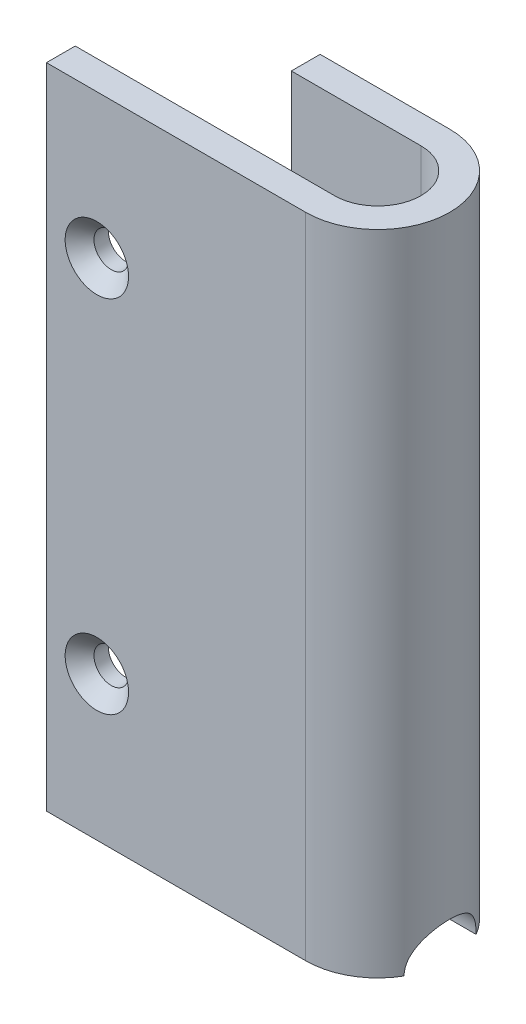
ISO-10303-21;
HEADER;
FILE_DESCRIPTION(('STEP AP214'),'2;1');
FILE_NAME('part.step','',(''),(''),'','','');
FILE_SCHEMA(('AUTOMOTIVE_DESIGN { 1 0 10303 214 1 1 1 1 }'));
ENDSEC;
DATA;
#1=APPLICATION_CONTEXT('core data for automotive mechanical design processes');
#2=APPLICATION_PROTOCOL_DEFINITION('international standard','automotive_design',2000,#1);
#3=PRODUCT_CONTEXT('',#1,'mechanical');
#4=PRODUCT('Part','Part','',(#3));
#5=PRODUCT_RELATED_PRODUCT_CATEGORY('part','',(#4));
#6=PRODUCT_DEFINITION_FORMATION('','',#4);
#7=PRODUCT_DEFINITION_CONTEXT('part definition',#1,'design');
#8=PRODUCT_DEFINITION('design','',#6,#7);
#9=PRODUCT_DEFINITION_SHAPE('','',#8);
#10=(LENGTH_UNIT() NAMED_UNIT(*) SI_UNIT(.MILLI.,.METRE.));
#11=(NAMED_UNIT(*) PLANE_ANGLE_UNIT() SI_UNIT($,.RADIAN.));
#12=(NAMED_UNIT(*) SI_UNIT($,.STERADIAN.) SOLID_ANGLE_UNIT());
#13=UNCERTAINTY_MEASURE_WITH_UNIT(LENGTH_MEASURE(1.E-05),#10,'distance_accuracy_value','');
#14=(GEOMETRIC_REPRESENTATION_CONTEXT(3) GLOBAL_UNCERTAINTY_ASSIGNED_CONTEXT((#13)) GLOBAL_UNIT_ASSIGNED_CONTEXT((#10,
#11,#12)) REPRESENTATION_CONTEXT('',''));
#15=CARTESIAN_POINT('',(0.,0.,0.));
#16=DIRECTION('',(0.,0.,1.));
#17=DIRECTION('',(1.,0.,0.));
#18=AXIS2_PLACEMENT_3D('',#15,#16,#17);
#19=CARTESIAN_POINT('',(0.,45.,0.));
#20=DIRECTION('',(0.,-1.,0.));
#21=DIRECTION('',(0.,0.,-1.));
#22=AXIS2_PLACEMENT_3D('',#19,#20,#21);
#23=CYLINDRICAL_SURFACE('',#22,5.);
#24=CARTESIAN_POINT('',(4.33012701892219,0.,-2.5));
#25=CARTESIAN_POINT('',(4.33010776213733,0.0654724350316677,-2.50001179836251));
#26=CARTESIAN_POINT('',(4.33161146224051,0.130934169776571,-2.49742842336447));
#27=CARTESIAN_POINT('',(4.33751978184666,0.261285899844576,-2.48716418163323));
#28=CARTESIAN_POINT('',(4.34192261900449,0.326176221640754,-2.47948644681233));
#29=CARTESIAN_POINT('',(4.35345141400719,0.454547532744297,-2.45918447990414));
#30=CARTESIAN_POINT('',(4.36056161975426,0.518034467963284,-2.44658885069503));
#31=CARTESIAN_POINT('',(4.37724282284499,0.643527614087744,-2.41661724515945));
#32=CARTESIAN_POINT('',(4.38681410283551,0.705533654022406,-2.3992407197456));
#33=CARTESIAN_POINT('',(4.41871214349951,0.888464031589053,-2.34029688750615));
#34=CARTESIAN_POINT('',(4.44426107983369,1.00668892728128,-2.29185258147667));
#35=CARTESIAN_POINT('',(4.50102114369154,1.23341693587535,-2.17826216975077));
#36=CARTESIAN_POINT('',(4.53224102252611,1.34190463038616,-2.11309018504652));
#37=CARTESIAN_POINT('',(4.59992530155802,1.55577114238783,-1.96165876169868));
#38=CARTESIAN_POINT('',(4.63660980230517,1.66016997889454,-1.87411057186877));
#39=CARTESIAN_POINT('',(4.70930785657946,1.85354271470454,-1.68311069098592));
#40=CARTESIAN_POINT('',(4.74532122571924,1.94251242917414,-1.57965469957761));
#41=CARTESIAN_POINT('',(4.81553674339751,2.10841707238449,-1.35122448738113));
#42=CARTESIAN_POINT('',(4.84945238909967,2.18413370998771,-1.22526897701463));
#43=CARTESIAN_POINT('',(4.90876871743035,2.31285185160815,-0.960393600863944));
#44=CARTESIAN_POINT('',(4.93417470668173,2.3658675177187,-0.821481883935598));
#45=CARTESIAN_POINT('',(4.9720113803684,2.44376131740857,-0.545113455243545));
#46=CARTESIAN_POINT('',(4.98523678997644,2.47037337425095,-0.408256720567087));
#47=CARTESIAN_POINT('',(5.00018956643823,2.50041524569561,-0.131428863746883));
#48=CARTESIAN_POINT('',(5.00192370311413,2.50385870956598,0.00854037595561001));
#49=CARTESIAN_POINT('',(4.99407451216908,2.48813324304431,0.274582525450838));
#50=CARTESIAN_POINT('',(4.98546223180199,2.47090463519448,0.40080541240597));
#51=CARTESIAN_POINT('',(4.95935579725978,2.41779719968455,0.648286752405086));
#52=CARTESIAN_POINT('',(4.94186114786187,2.38191733214957,0.769544928241872));
#53=CARTESIAN_POINT('',(4.89928974288563,2.29229393966775,1.00577259267237));
#54=CARTESIAN_POINT('',(4.87411141896958,2.23831009471259,1.12063184244932));
#55=CARTESIAN_POINT('',(4.81844159486509,2.11434242062065,1.3399404674424));
#56=CARTESIAN_POINT('',(4.78794811508603,2.04435262714526,1.44438594125974));
#57=CARTESIAN_POINT('',(4.72111214797706,1.8827673990732,1.65042713157186));
#58=CARTESIAN_POINT('',(4.68448924833205,1.78975568976913,1.75082198597595));
#59=CARTESIAN_POINT('',(4.61136315843599,1.58853854847496,1.9352501871044));
#60=CARTESIAN_POINT('',(4.5748601047173,1.48031958801658,2.01926880480682));
#61=CARTESIAN_POINT('',(4.503579139904,1.24330068232173,2.1738171411083));
#62=CARTESIAN_POINT('',(4.46906219482226,1.11362572851798,2.24313548885981));
#63=CARTESIAN_POINT('',(4.40934996096533,0.842442531530035,2.35836398289386));
#64=CARTESIAN_POINT('',(4.38413238163266,0.700963594907247,2.40433020546799));
#65=CARTESIAN_POINT('',(4.35412015572563,0.465222711798028,2.45809029210406));
#66=CARTESIAN_POINT('',(4.34521143406772,0.373217559621034,2.47373896858613));
#67=CARTESIAN_POINT('',(4.33317629399904,0.187508830095871,2.49472015739655));
#68=CARTESIAN_POINT('',(4.33006008341912,0.0938025477150808,2.50003445877024));
#69=CARTESIAN_POINT('',(4.33012701892219,0.,2.5));
#70=B_SPLINE_CURVE_WITH_KNOTS('',3,(#24,#25,#26,#27,#28,#29,#30,#31,#32,#33,#34,#35,#36,#37,#38,
#39,#40,#41,#42,#43,#44,#45,#46,#47,#48,#49,#50,#51,#52,#53,#54,#55,#56,#57,#58,#59,#60,#61,#62,
#63,#64,#65,#66,#67,#68,#69),.UNSPECIFIED.,.F.,.F.,(4,2,2,2,2,2,2,2,2,2,2,2,2,2,2,2,2,2,2,2,2,2,
4),(0.,0.196331555537111,0.392542521988314,0.587628912502733,0.782737718108245,1.17178476798555,
1.56143737011987,1.98295902719593,2.40459483519142,2.85470113901088,3.30452623161875,
3.72233927392692,4.13990614928148,4.52116163006039,4.90243836948527,5.28899106640394,
5.67568804085465,6.09890794628564,6.52250676283661,6.97328472614771,7.42297504209209,
7.703516039156,7.98455095154996),.UNSPECIFIED.);
#71=CARTESIAN_POINT('',(4.33012701892219,0.,-2.5));
#72=VERTEX_POINT('',#71);
#73=CARTESIAN_POINT('',(4.33012701892219,0.,2.5));
#74=VERTEX_POINT('',#73);
#75=EDGE_CURVE('E53',#72,#74,#70,.T.);
#76=ORIENTED_EDGE('',*,*,#75,.F.);
#77=CARTESIAN_POINT('',(0.,0.,0.));
#78=DIRECTION('',(0.,1.,0.));
#79=DIRECTION('',(0.,0.,1.));
#80=AXIS2_PLACEMENT_3D('',#77,#78,#79);
#81=CIRCLE('',#80,5.);
#82=CARTESIAN_POINT('',(0.,0.,-5.));
#83=VERTEX_POINT('',#82);
#84=EDGE_CURVE('E255',#72,#83,#81,.T.);
#85=ORIENTED_EDGE('',*,*,#84,.T.);
#86=DIRECTION('',(0.,-1.,0.));
#87=VECTOR('',#86,1.);
#88=CARTESIAN_POINT('',(0.,45.,-5.));
#89=LINE('',#88,#87);
#90=CARTESIAN_POINT('',(0.,45.,-5.));
#91=VERTEX_POINT('',#90);
#92=EDGE_CURVE('E183',#91,#83,#89,.T.);
#93=ORIENTED_EDGE('',*,*,#92,.F.);
#94=CARTESIAN_POINT('',(0.,45.,0.));
#95=DIRECTION('',(0.,1.,0.));
#96=DIRECTION('',(0.,0.,1.));
#97=AXIS2_PLACEMENT_3D('',#94,#95,#96);
#98=CIRCLE('',#97,5.);
#99=CARTESIAN_POINT('',(0.,45.,5.));
#100=VERTEX_POINT('',#99);
#101=EDGE_CURVE('E160',#100,#91,#98,.T.);
#102=ORIENTED_EDGE('',*,*,#101,.F.);
#103=DIRECTION('',(0.,-1.,0.));
#104=VECTOR('',#103,1.);
#105=CARTESIAN_POINT('',(0.,45.,5.));
#106=LINE('',#105,#104);
#107=CARTESIAN_POINT('',(0.,0.,5.));
#108=VERTEX_POINT('',#107);
#109=EDGE_CURVE('E161',#100,#108,#106,.T.);
#110=ORIENTED_EDGE('',*,*,#109,.T.);
#111=EDGE_CURVE('E257',#108,#74,#81,.T.);
#112=ORIENTED_EDGE('',*,*,#111,.T.);
#113=EDGE_LOOP('',(#76,#85,#93,#102,#110,#112));
#114=FACE_BOUND('',#113,.T.);
#115=ADVANCED_FACE('F37',(#114),#23,.T.);
#116=CARTESIAN_POINT('',(0.,45.,0.));
#117=DIRECTION('',(0.,-1.,0.));
#118=DIRECTION('',(0.,0.,-1.));
#119=AXIS2_PLACEMENT_3D('',#116,#117,#118);
#120=CYLINDRICAL_SURFACE('',#119,3.);
#121=CARTESIAN_POINT('',(1.6583123951777,0.,2.5));
#122=CARTESIAN_POINT('',(1.65828023930748,0.0446676190961317,2.50001053689097));
#123=CARTESIAN_POINT('',(1.6601162772629,0.0893146756582369,2.4988033626358));
#124=CARTESIAN_POINT('',(1.66727317263237,0.178118808575002,2.49403945424106));
#125=CARTESIAN_POINT('',(1.6725873117957,0.222276662985004,2.49048724961452));
#126=CARTESIAN_POINT('',(1.68634898291668,0.309186552805204,2.48118723003889));
#127=CARTESIAN_POINT('',(1.69474943169534,0.351949707497493,2.47547237004125));
#128=CARTESIAN_POINT('',(1.71430901873713,0.436516845554968,2.46196831278083));
#129=CARTESIAN_POINT('',(1.72546968412583,0.478320283905717,2.4541779670438));
#130=CARTESIAN_POINT('',(1.77222694334977,0.634726425048257,2.42094569151118));
#131=CARTESIAN_POINT('',(1.81578246635465,0.745590990119863,2.38888265367655));
#132=CARTESIAN_POINT('',(1.91309058631366,0.958667215286081,2.31170305357438));
#133=CARTESIAN_POINT('',(1.96692669689501,1.06079733200861,2.26647787223487));
#134=CARTESIAN_POINT('',(2.06333806009318,1.22908717969098,2.17845139252835));
#135=CARTESIAN_POINT('',(2.1048774408808,1.29734727342663,2.13847839662807));
#136=CARTESIAN_POINT('',(2.18877312173698,1.42945216003766,2.05253160808423));
#137=CARTESIAN_POINT('',(2.23112976012055,1.49329507193551,2.00655528279989));
#138=CARTESIAN_POINT('',(2.35737927069942,1.6779004660602,1.85992335660286));
#139=CARTESIAN_POINT('',(2.44073385868862,1.79220223726549,1.75032166679399));
#140=CARTESIAN_POINT('',(2.58107663651362,1.97858484857952,1.53332316028441));
#141=CARTESIAN_POINT('',(2.63991085386503,2.05448117836859,1.43037180448629));
#142=CARTESIAN_POINT('',(2.74774689794263,2.1913233385864,1.2102993528412));
#143=CARTESIAN_POINT('',(2.79676246687923,2.25229009148166,1.09319843428568));
#144=CARTESIAN_POINT('',(2.87372981565163,2.34711358323241,0.867928883305844));
#145=CARTESIAN_POINT('',(2.90385830152504,2.38383517864743,0.761717046456572));
#146=CARTESIAN_POINT('',(2.95260444248339,2.44298114981979,0.542830448073814));
#147=CARTESIAN_POINT('',(2.97122910862281,2.46541423403497,0.430159668824158));
#148=CARTESIAN_POINT('',(2.99549159829453,2.49460149180071,0.200906226670661));
#149=CARTESIAN_POINT('',(3.00107488681869,2.50128982658614,0.084309197767444));
#150=CARTESIAN_POINT('',(2.99858143920542,2.49829775944192,-0.148527340090261));
#151=CARTESIAN_POINT('',(2.99050499932993,2.48861771252143,-0.264766856743951));
#152=CARTESIAN_POINT('',(2.9624133944372,2.45478579221321,-0.485445759029536));
#153=CARTESIAN_POINT('',(2.94323604357122,2.4316490006219,-0.590153469719608));
#154=CARTESIAN_POINT('',(2.89501327215416,2.37305235039453,-0.793625750717645));
#155=CARTESIAN_POINT('',(2.86596638567854,2.33759066112049,-0.89238943559136));
#156=CARTESIAN_POINT('',(2.79690287446882,2.25240860554023,-1.09053416369654));
#157=CARTESIAN_POINT('',(2.7561602110168,2.20172771983301,-1.18924473934223));
#158=CARTESIAN_POINT('',(2.66744714285833,2.08960269254212,-1.37678007181262));
#159=CARTESIAN_POINT('',(2.61947031903861,2.02814898391746,-1.46559592577918));
#160=CARTESIAN_POINT('',(2.49448801107938,1.86454080960493,-1.67280362441447));
#161=CARTESIAN_POINT('',(2.41452810108691,1.75692904106795,-1.78517382835749));
#162=CARTESIAN_POINT('',(2.29203972156857,1.58276013263233,-1.93670155603641));
#163=CARTESIAN_POINT('',(2.25072647403066,1.52248619627438,-1.98442714978064));
#164=CARTESIAN_POINT('',(2.16828385513605,1.3977282287984,-2.07418686478912));
#165=CARTESIAN_POINT('',(2.12715442261522,1.33324573004269,-2.11622304065683));
#166=CARTESIAN_POINT('',(2.02736668216146,1.16889290959049,-2.2128219038431));
#167=CARTESIAN_POINT('',(1.96949413582952,1.06656162182181,-2.26406445132993));
#168=CARTESIAN_POINT('',(1.86215058777701,0.852162280933745,-2.35313154217165));
#169=CARTESIAN_POINT('',(1.81265778441366,0.740120677710054,-2.39099119237605));
#170=CARTESIAN_POINT('',(1.74312521040049,0.542368123492112,-2.44187928159533));
#171=CARTESIAN_POINT('',(1.71871174214238,0.459278569532435,-2.45896760338397));
#172=CARTESIAN_POINT('',(1.68136078058062,0.289382777852337,-2.48466533863309));
#173=CARTESIAN_POINT('',(1.66838023493806,0.202591784872539,-2.49330657445815));
#174=CARTESIAN_POINT('',(1.66098011654761,0.0960725270432394,-2.49822814088172));
#175=CARTESIAN_POINT('',(1.65998140373825,0.0768814878014884,-2.49889195042314));
#176=CARTESIAN_POINT('',(1.65864846758548,0.0384623376736757,-2.49977745262101));
#177=CARTESIAN_POINT('',(1.65831437598636,0.0192342201937559,-2.49999905762164));
#178=CARTESIAN_POINT('',(1.6583123951777,0.,-2.5));
#179=B_SPLINE_CURVE_WITH_KNOTS('',3,(#121,#122,#123,#124,#125,#126,#127,#128,#129,#130,#131,
#132,#133,#134,#135,#136,#137,#138,#139,#140,#141,#142,#143,#144,#145,#146,#147,#148,#149,#150,
#151,#152,#153,#154,#155,#156,#157,#158,#159,#160,#161,#162,#163,#164,#165,#166,#167,#168,#169,
#170,#171,#172,#173,#174,#175,#176,#177,#178),.UNSPECIFIED.,.F.,.F.,(4,2,2,2,2,2,2,2,2,2,2,2,2,
2,2,2,2,2,2,2,2,2,2,2,2,2,2,2,4),(0.,0.133915809511519,0.267573709534379,0.399271959248707,
0.531043236367043,0.898867426511492,1.26981755381918,1.53753000139772,1.80535575667043,
2.33924592067391,2.76010881123974,3.18037848070635,3.52797653415752,3.87536253284726,
4.22419861170399,4.57302712485182,4.89843954153486,5.22390031294722,5.57721326116426,
5.93084158108768,6.45264424433969,6.71427180911988,6.97580463953598,7.35949670871463,
7.74217465007992,8.00607441227289,8.26897611958204,8.32665105551861,8.38433742291031),.UNSPECIFIED.);
#180=CARTESIAN_POINT('',(1.6583123951777,0.,2.5));
#181=VERTEX_POINT('',#180);
#182=CARTESIAN_POINT('',(1.6583123951777,0.,-2.5));
#183=VERTEX_POINT('',#182);
#184=EDGE_CURVE('E126',#181,#183,#179,.T.);
#185=ORIENTED_EDGE('',*,*,#184,.F.);
#186=CARTESIAN_POINT('',(0.,0.,0.));
#187=DIRECTION('',(0.,-1.,0.));
#188=DIRECTION('',(0.,0.,1.));
#189=AXIS2_PLACEMENT_3D('',#186,#187,#188);
#190=CIRCLE('',#189,3.);
#191=CARTESIAN_POINT('',(0.,0.,3.));
#192=VERTEX_POINT('',#191);
#193=EDGE_CURVE('E138',#181,#192,#190,.T.);
#194=ORIENTED_EDGE('',*,*,#193,.T.);
#195=DIRECTION('',(0.,-1.,0.));
#196=VECTOR('',#195,1.);
#197=CARTESIAN_POINT('',(0.,45.,3.));
#198=LINE('',#197,#196);
#199=CARTESIAN_POINT('',(0.,45.,3.));
#200=VERTEX_POINT('',#199);
#201=EDGE_CURVE('E171',#200,#192,#198,.T.);
#202=ORIENTED_EDGE('',*,*,#201,.F.);
#203=CARTESIAN_POINT('',(0.,45.,0.));
#204=DIRECTION('',(0.,-1.,0.));
#205=DIRECTION('',(0.,0.,1.));
#206=AXIS2_PLACEMENT_3D('',#203,#204,#205);
#207=CIRCLE('',#206,3.);
#208=CARTESIAN_POINT('',(0.,45.,-3.));
#209=VERTEX_POINT('',#208);
#210=EDGE_CURVE('E277',#209,#200,#207,.T.);
#211=ORIENTED_EDGE('',*,*,#210,.F.);
#212=DIRECTION('',(0.,-1.,0.));
#213=VECTOR('',#212,1.);
#214=CARTESIAN_POINT('',(0.,45.,-3.));
#215=LINE('',#214,#213);
#216=CARTESIAN_POINT('',(0.,0.,-3.));
#217=VERTEX_POINT('',#216);
#218=EDGE_CURVE('E173',#209,#217,#215,.T.);
#219=ORIENTED_EDGE('',*,*,#218,.T.);
#220=EDGE_CURVE('E142',#217,#183,#190,.T.);
#221=ORIENTED_EDGE('',*,*,#220,.T.);
#222=EDGE_LOOP('',(#185,#194,#202,#211,#219,#221));
#223=FACE_BOUND('',#222,.T.);
#224=ADVANCED_FACE('F136',(#223),#120,.F.);
#225=CARTESIAN_POINT('',(0.,0.,0.));
#226=DIRECTION('',(0.,1.,0.));
#227=DIRECTION('',(0.,0.,1.));
#228=AXIS2_PLACEMENT_3D('',#225,#226,#227);
#229=PLANE('',#228);
#230=DIRECTION('',(-1.,0.,0.));
#231=VECTOR('',#230,1.);
#232=CARTESIAN_POINT('',(6.,0.,-2.5));
#233=LINE('',#232,#231);
#234=EDGE_CURVE('E11',#183,#72,#233,.F.);
#235=ORIENTED_EDGE('',*,*,#234,.F.);
#236=ORIENTED_EDGE('',*,*,#220,.F.);
#237=DIRECTION('',(1.,0.,0.));
#238=VECTOR('',#237,1.);
#239=CARTESIAN_POINT('',(0.,0.,-3.));
#240=LINE('',#239,#238);
#241=CARTESIAN_POINT('',(-9.,0.,-3.));
#242=VERTEX_POINT('',#241);
#243=EDGE_CURVE('E149',#242,#217,#240,.T.);
#244=ORIENTED_EDGE('',*,*,#243,.F.);
#245=DIRECTION('',(0.,0.,1.));
#246=VECTOR('',#245,1.);
#247=CARTESIAN_POINT('',(-9.,0.,-5.));
#248=LINE('',#247,#246);
#249=CARTESIAN_POINT('',(-9.,0.,-5.));
#250=VERTEX_POINT('',#249);
#251=EDGE_CURVE('E151',#250,#242,#248,.T.);
#252=ORIENTED_EDGE('',*,*,#251,.F.);
#253=DIRECTION('',(-1.,0.,0.));
#254=VECTOR('',#253,1.);
#255=CARTESIAN_POINT('',(0.,0.,-5.));
#256=LINE('',#255,#254);
#257=EDGE_CURVE('E261',#83,#250,#256,.T.);
#258=ORIENTED_EDGE('',*,*,#257,.F.);
#259=ORIENTED_EDGE('',*,*,#84,.F.);
#260=EDGE_LOOP('',(#235,#236,#244,#252,#258,#259));
#261=FACE_BOUND('',#260,.T.);
#262=ADVANCED_FACE('F228',(#261),#229,.F.);
#263=DIRECTION('',(-1.,0.,0.));
#264=VECTOR('',#263,1.);
#265=CARTESIAN_POINT('',(6.,0.,2.5));
#266=LINE('',#265,#264);
#267=EDGE_CURVE('E46',#74,#181,#266,.T.);
#268=ORIENTED_EDGE('',*,*,#267,.F.);
#269=ORIENTED_EDGE('',*,*,#111,.F.);
#270=DIRECTION('',(1.,0.,0.));
#271=VECTOR('',#270,1.);
#272=CARTESIAN_POINT('',(0.,0.,5.));
#273=LINE('',#272,#271);
#274=CARTESIAN_POINT('',(-18.,0.,5.));
#275=VERTEX_POINT('',#274);
#276=EDGE_CURVE('E158',#275,#108,#273,.T.);
#277=ORIENTED_EDGE('',*,*,#276,.F.);
#278=DIRECTION('',(0.,0.,1.));
#279=VECTOR('',#278,1.);
#280=CARTESIAN_POINT('',(-18.,0.,3.));
#281=LINE('',#280,#279);
#282=CARTESIAN_POINT('',(-18.,0.,3.));
#283=VERTEX_POINT('',#282);
#284=EDGE_CURVE('E156',#283,#275,#281,.T.);
#285=ORIENTED_EDGE('',*,*,#284,.F.);
#286=DIRECTION('',(-1.,0.,0.));
#287=VECTOR('',#286,1.);
#288=CARTESIAN_POINT('',(0.,0.,3.));
#289=LINE('',#288,#287);
#290=EDGE_CURVE('E148',#192,#283,#289,.T.);
#291=ORIENTED_EDGE('',*,*,#290,.F.);
#292=ORIENTED_EDGE('',*,*,#193,.F.);
#293=EDGE_LOOP('',(#268,#269,#277,#285,#291,#292));
#294=FACE_BOUND('',#293,.T.);
#295=ADVANCED_FACE('F146',(#294),#229,.F.);
#296=CARTESIAN_POINT('',(-9.,45.,-5.));
#297=DIRECTION('',(1.,0.,0.));
#298=DIRECTION('',(0.,0.,-1.));
#299=AXIS2_PLACEMENT_3D('',#296,#297,#298);
#300=PLANE('',#299);
#301=DIRECTION('',(0.,-1.,0.));
#302=VECTOR('',#301,1.);
#303=CARTESIAN_POINT('',(-9.,45.,-3.));
#304=LINE('',#303,#302);
#305=CARTESIAN_POINT('',(-9.,16.5,-3.));
#306=VERTEX_POINT('',#305);
#307=EDGE_CURVE('E175',#306,#242,#304,.T.);
#308=ORIENTED_EDGE('',*,*,#307,.F.);
#309=DIRECTION('',(0.,0.,-1.));
#310=VECTOR('',#309,1.);
#311=CARTESIAN_POINT('',(-9.,16.5,0.));
#312=LINE('',#311,#310);
#313=CARTESIAN_POINT('',(-9.,16.5,-5.));
#314=VERTEX_POINT('',#313);
#315=EDGE_CURVE('E61',#306,#314,#312,.T.);
#316=ORIENTED_EDGE('',*,*,#315,.T.);
#317=DIRECTION('',(0.,-1.,0.));
#318=VECTOR('',#317,1.);
#319=CARTESIAN_POINT('',(-9.,45.,-5.));
#320=LINE('',#319,#318);
#321=EDGE_CURVE('E179',#314,#250,#320,.T.);
#322=ORIENTED_EDGE('',*,*,#321,.T.);
#323=ORIENTED_EDGE('',*,*,#251,.T.);
#324=EDGE_LOOP('',(#308,#316,#322,#323));
#325=FACE_BOUND('',#324,.T.);
#326=ADVANCED_FACE('F272',(#325),#300,.F.);
#327=CARTESIAN_POINT('',(0.,45.,-5.));
#328=DIRECTION('',(0.,0.,1.));
#329=DIRECTION('',(1.,0.,0.));
#330=AXIS2_PLACEMENT_3D('',#327,#328,#329);
#331=PLANE('',#330);
#332=ORIENTED_EDGE('',*,*,#321,.F.);
#333=CARTESIAN_POINT('',(-9.,17.5,-5.));
#334=DIRECTION('',(0.,0.,-1.));
#335=DIRECTION('',(-1.,0.,0.));
#336=AXIS2_PLACEMENT_3D('',#333,#334,#335);
#337=CIRCLE('',#336,1.);
#338=CARTESIAN_POINT('',(-9.,18.5,-5.));
#339=VERTEX_POINT('',#338);
#340=EDGE_CURVE('E258',#339,#314,#337,.T.);
#341=ORIENTED_EDGE('',*,*,#340,.F.);
#342=CARTESIAN_POINT('',(-9.,45.,-5.));
#343=VERTEX_POINT('',#342);
#344=EDGE_CURVE('E180',#343,#339,#320,.T.);
#345=ORIENTED_EDGE('',*,*,#344,.F.);
#346=DIRECTION('',(-1.,0.,0.));
#347=VECTOR('',#346,1.);
#348=CARTESIAN_POINT('',(0.,45.,-5.));
#349=LINE('',#348,#347);
#350=EDGE_CURVE('E295',#91,#343,#349,.T.);
#351=ORIENTED_EDGE('',*,*,#350,.F.);
#352=ORIENTED_EDGE('',*,*,#92,.T.);
#353=ORIENTED_EDGE('',*,*,#257,.T.);
#354=EDGE_LOOP('',(#332,#341,#345,#351,#352,#353));
#355=FACE_BOUND('',#354,.T.);
#356=ADVANCED_FACE('F306',(#355),#331,.F.);
#357=ORIENTED_EDGE('',*,*,#344,.T.);
#358=DIRECTION('',(0.,0.,-1.));
#359=VECTOR('',#358,1.);
#360=CARTESIAN_POINT('',(-9.,18.5,0.));
#361=LINE('',#360,#359);
#362=CARTESIAN_POINT('',(-9.,18.5,-3.));
#363=VERTEX_POINT('',#362);
#364=EDGE_CURVE('E263',#339,#363,#361,.F.);
#365=ORIENTED_EDGE('',*,*,#364,.T.);
#366=CARTESIAN_POINT('',(-9.,45.,-3.));
#367=VERTEX_POINT('',#366);
#368=EDGE_CURVE('E176',#367,#363,#304,.T.);
#369=ORIENTED_EDGE('',*,*,#368,.F.);
#370=DIRECTION('',(0.,0.,1.));
#371=VECTOR('',#370,1.);
#372=CARTESIAN_POINT('',(-9.,45.,-5.));
#373=LINE('',#372,#371);
#374=EDGE_CURVE('E284',#343,#367,#373,.T.);
#375=ORIENTED_EDGE('',*,*,#374,.F.);
#376=EDGE_LOOP('',(#357,#365,#369,#375));
#377=FACE_BOUND('',#376,.T.);
#378=ADVANCED_FACE('F245',(#377),#300,.F.);
#379=CARTESIAN_POINT('',(0.,45.,-3.));
#380=DIRECTION('',(0.,0.,-1.));
#381=DIRECTION('',(-1.,0.,0.));
#382=AXIS2_PLACEMENT_3D('',#379,#380,#381);
#383=PLANE('',#382);
#384=ORIENTED_EDGE('',*,*,#368,.T.);
#385=CARTESIAN_POINT('',(-9.,17.5,-3.));
#386=DIRECTION('',(0.,0.,-1.));
#387=DIRECTION('',(-1.,0.,0.));
#388=AXIS2_PLACEMENT_3D('',#385,#386,#387);
#389=CIRCLE('',#388,1.);
#390=EDGE_CURVE('E132',#363,#306,#389,.T.);
#391=ORIENTED_EDGE('',*,*,#390,.T.);
#392=ORIENTED_EDGE('',*,*,#307,.T.);
#393=ORIENTED_EDGE('',*,*,#243,.T.);
#394=ORIENTED_EDGE('',*,*,#218,.F.);
#395=DIRECTION('',(1.,0.,0.));
#396=VECTOR('',#395,1.);
#397=CARTESIAN_POINT('',(0.,45.,-3.));
#398=LINE('',#397,#396);
#399=EDGE_CURVE('E280',#367,#209,#398,.T.);
#400=ORIENTED_EDGE('',*,*,#399,.F.);
#401=EDGE_LOOP('',(#384,#391,#392,#393,#394,#400));
#402=FACE_BOUND('',#401,.T.);
#403=ADVANCED_FACE('F240',(#402),#383,.F.);
#404=CARTESIAN_POINT('',(0.,45.,3.));
#405=DIRECTION('',(0.,0.,1.));
#406=DIRECTION('',(1.,0.,0.));
#407=AXIS2_PLACEMENT_3D('',#404,#405,#406);
#408=PLANE('',#407);
#409=CARTESIAN_POINT('',(-14.5,35.,3.));
#410=DIRECTION('',(0.,0.,1.));
#411=DIRECTION('',(1.,0.,0.));
#412=AXIS2_PLACEMENT_3D('',#409,#410,#411);
#413=CIRCLE('',#412,1.2);
#414=CARTESIAN_POINT('',(-13.3,35.,3.));
#415=VERTEX_POINT('',#414);
#416=EDGE_CURVE('E41',#415,#415,#413,.T.);
#417=ORIENTED_EDGE('',*,*,#416,.T.);
#418=EDGE_LOOP('',(#417));
#419=FACE_BOUND('',#418,.T.);
#420=CARTESIAN_POINT('',(-14.5,9.99999999999999,3.));
#421=DIRECTION('',(0.,0.,1.));
#422=DIRECTION('',(1.,0.,0.));
#423=AXIS2_PLACEMENT_3D('',#420,#421,#422);
#424=CIRCLE('',#423,1.2);
#425=CARTESIAN_POINT('',(-13.3,9.99999999999999,3.));
#426=VERTEX_POINT('',#425);
#427=EDGE_CURVE('E143',#426,#426,#424,.T.);
#428=ORIENTED_EDGE('',*,*,#427,.T.);
#429=EDGE_LOOP('',(#428));
#430=FACE_BOUND('',#429,.T.);
#431=ORIENTED_EDGE('',*,*,#290,.T.);
#432=DIRECTION('',(0.,-1.,0.));
#433=VECTOR('',#432,1.);
#434=CARTESIAN_POINT('',(-18.,45.,3.));
#435=LINE('',#434,#433);
#436=CARTESIAN_POINT('',(-18.,45.,3.));
#437=VERTEX_POINT('',#436);
#438=EDGE_CURVE('E168',#437,#283,#435,.T.);
#439=ORIENTED_EDGE('',*,*,#438,.F.);
#440=DIRECTION('',(-1.,0.,0.));
#441=VECTOR('',#440,1.);
#442=CARTESIAN_POINT('',(0.,45.,3.));
#443=LINE('',#442,#441);
#444=EDGE_CURVE('E279',#200,#437,#443,.T.);
#445=ORIENTED_EDGE('',*,*,#444,.F.);
#446=ORIENTED_EDGE('',*,*,#201,.T.);
#447=EDGE_LOOP('',(#431,#439,#445,#446));
#448=FACE_BOUND('',#447,.T.);
#449=ADVANCED_FACE('F237',(#419,#430,#448),#408,.F.);
#450=CARTESIAN_POINT('',(-18.,45.,3.));
#451=DIRECTION('',(1.,0.,0.));
#452=DIRECTION('',(0.,0.,-1.));
#453=AXIS2_PLACEMENT_3D('',#450,#451,#452);
#454=PLANE('',#453);
#455=ORIENTED_EDGE('',*,*,#284,.T.);
#456=DIRECTION('',(0.,-1.,0.));
#457=VECTOR('',#456,1.);
#458=CARTESIAN_POINT('',(-18.,45.,5.));
#459=LINE('',#458,#457);
#460=CARTESIAN_POINT('',(-18.,45.,5.));
#461=VERTEX_POINT('',#460);
#462=EDGE_CURVE('E164',#461,#275,#459,.T.);
#463=ORIENTED_EDGE('',*,*,#462,.F.);
#464=DIRECTION('',(0.,0.,1.));
#465=VECTOR('',#464,1.);
#466=CARTESIAN_POINT('',(-18.,45.,3.));
#467=LINE('',#466,#465);
#468=EDGE_CURVE('E282',#437,#461,#467,.T.);
#469=ORIENTED_EDGE('',*,*,#468,.F.);
#470=ORIENTED_EDGE('',*,*,#438,.T.);
#471=EDGE_LOOP('',(#455,#463,#469,#470));
#472=FACE_BOUND('',#471,.T.);
#473=ADVANCED_FACE('F234',(#472),#454,.F.);
#474=CARTESIAN_POINT('',(0.,45.,5.));
#475=DIRECTION('',(0.,0.,-1.));
#476=DIRECTION('',(-1.,0.,0.));
#477=AXIS2_PLACEMENT_3D('',#474,#475,#476);
#478=PLANE('',#477);
#479=CARTESIAN_POINT('',(-14.5,35.,5.));
#480=DIRECTION('',(0.,0.,1.));
#481=DIRECTION('',(1.,0.,0.));
#482=AXIS2_PLACEMENT_3D('',#479,#480,#481);
#483=CIRCLE('',#482,2.2);
#484=CARTESIAN_POINT('',(-12.3,35.,5.));
#485=VERTEX_POINT('',#484);
#486=EDGE_CURVE('E424',#485,#485,#483,.T.);
#487=ORIENTED_EDGE('',*,*,#486,.F.);
#488=EDGE_LOOP('',(#487));
#489=FACE_BOUND('',#488,.T.);
#490=CARTESIAN_POINT('',(-14.5,9.99999999999999,5.));
#491=DIRECTION('',(0.,0.,1.));
#492=DIRECTION('',(1.,0.,0.));
#493=AXIS2_PLACEMENT_3D('',#490,#491,#492);
#494=CIRCLE('',#493,2.2);
#495=CARTESIAN_POINT('',(-12.3,9.99999999999999,5.));
#496=VERTEX_POINT('',#495);
#497=EDGE_CURVE('E191',#496,#496,#494,.T.);
#498=ORIENTED_EDGE('',*,*,#497,.F.);
#499=EDGE_LOOP('',(#498));
#500=FACE_BOUND('',#499,.T.);
#501=ORIENTED_EDGE('',*,*,#276,.T.);
#502=ORIENTED_EDGE('',*,*,#109,.F.);
#503=DIRECTION('',(1.,0.,0.));
#504=VECTOR('',#503,1.);
#505=CARTESIAN_POINT('',(0.,45.,5.));
#506=LINE('',#505,#504);
#507=EDGE_CURVE('E165',#461,#100,#506,.T.);
#508=ORIENTED_EDGE('',*,*,#507,.F.);
#509=ORIENTED_EDGE('',*,*,#462,.T.);
#510=EDGE_LOOP('',(#501,#502,#508,#509));
#511=FACE_BOUND('',#510,.T.);
#512=ADVANCED_FACE('F226',(#489,#500,#511),#478,.F.);
#513=CARTESIAN_POINT('',(0.,45.,0.));
#514=DIRECTION('',(0.,1.,0.));
#515=DIRECTION('',(0.,0.,1.));
#516=AXIS2_PLACEMENT_3D('',#513,#514,#515);
#517=PLANE('',#516);
#518=ORIENTED_EDGE('',*,*,#101,.T.);
#519=ORIENTED_EDGE('',*,*,#350,.T.);
#520=ORIENTED_EDGE('',*,*,#374,.T.);
#521=ORIENTED_EDGE('',*,*,#399,.T.);
#522=ORIENTED_EDGE('',*,*,#210,.T.);
#523=ORIENTED_EDGE('',*,*,#444,.T.);
#524=ORIENTED_EDGE('',*,*,#468,.T.);
#525=ORIENTED_EDGE('',*,*,#507,.T.);
#526=EDGE_LOOP('',(#518,#519,#520,#521,#522,#523,#524,#525));
#527=FACE_BOUND('',#526,.T.);
#528=ADVANCED_FACE('F223',(#527),#517,.T.);
#529=CARTESIAN_POINT('',(-9.,17.5,0.));
#530=DIRECTION('',(0.,0.,-1.));
#531=DIRECTION('',(-1.,0.,0.));
#532=AXIS2_PLACEMENT_3D('',#529,#530,#531);
#533=CYLINDRICAL_SURFACE('',#532,1.);
#534=ORIENTED_EDGE('',*,*,#390,.F.);
#535=ORIENTED_EDGE('',*,*,#364,.F.);
#536=ORIENTED_EDGE('',*,*,#340,.T.);
#537=ORIENTED_EDGE('',*,*,#315,.F.);
#538=EDGE_LOOP('',(#534,#535,#536,#537));
#539=FACE_BOUND('',#538,.T.);
#540=ADVANCED_FACE('F218',(#539),#533,.F.);
#541=CARTESIAN_POINT('',(6.,0.,0.));
#542=DIRECTION('',(-1.,0.,0.));
#543=DIRECTION('',(0.,0.,1.));
#544=AXIS2_PLACEMENT_3D('',#541,#542,#543);
#545=CYLINDRICAL_SURFACE('',#544,2.5);
#546=ORIENTED_EDGE('',*,*,#234,.T.);
#547=ORIENTED_EDGE('',*,*,#75,.T.);
#548=ORIENTED_EDGE('',*,*,#267,.T.);
#549=ORIENTED_EDGE('',*,*,#184,.T.);
#550=EDGE_LOOP('',(#546,#547,#548,#549));
#551=FACE_BOUND('',#550,.T.);
#552=ADVANCED_FACE('F125',(#551),#545,.F.);
#553=CARTESIAN_POINT('',(-14.5,9.99999999999999,5.));
#554=DIRECTION('',(0.,0.,1.));
#555=DIRECTION('',(1.,0.,0.));
#556=AXIS2_PLACEMENT_3D('',#553,#554,#555);
#557=CYLINDRICAL_SURFACE('',#556,1.2);
#558=CARTESIAN_POINT('',(-14.5,9.99999999999999,4.));
#559=DIRECTION('',(0.,0.,1.));
#560=DIRECTION('',(1.,0.,0.));
#561=AXIS2_PLACEMENT_3D('',#558,#559,#560);
#562=CIRCLE('',#561,1.2);
#563=CARTESIAN_POINT('',(-13.3,9.99999999999999,4.));
#564=VERTEX_POINT('',#563);
#565=EDGE_CURVE('E187',#564,#564,#562,.T.);
#566=ORIENTED_EDGE('',*,*,#565,.T.);
#567=EDGE_LOOP('',(#566));
#568=FACE_BOUND('',#567,.T.);
#569=ORIENTED_EDGE('',*,*,#427,.F.);
#570=EDGE_LOOP('',(#569));
#571=FACE_BOUND('',#570,.T.);
#572=ADVANCED_FACE('F217',(#568,#571),#557,.F.);
#573=CARTESIAN_POINT('',(-14.5,9.99999999999999,5.));
#574=DIRECTION('',(0.,0.,1.));
#575=DIRECTION('',(1.,0.,0.));
#576=AXIS2_PLACEMENT_3D('',#573,#574,#575);
#577=CONICAL_SURFACE('',#576,2.2,0.785398163397448);
#578=ORIENTED_EDGE('',*,*,#565,.F.);
#579=EDGE_LOOP('',(#578));
#580=FACE_BOUND('',#579,.T.);
#581=ORIENTED_EDGE('',*,*,#497,.T.);
#582=EDGE_LOOP('',(#581));
#583=FACE_BOUND('',#582,.T.);
#584=ADVANCED_FACE('F387',(#580,#583),#577,.F.);
#585=CARTESIAN_POINT('',(-14.5,35.,5.));
#586=DIRECTION('',(0.,0.,1.));
#587=DIRECTION('',(1.,0.,0.));
#588=AXIS2_PLACEMENT_3D('',#585,#586,#587);
#589=CYLINDRICAL_SURFACE('',#588,1.2);
#590=CARTESIAN_POINT('',(-14.5,35.,4.));
#591=DIRECTION('',(0.,0.,1.));
#592=DIRECTION('',(1.,0.,0.));
#593=AXIS2_PLACEMENT_3D('',#590,#591,#592);
#594=CIRCLE('',#593,1.2);
#595=CARTESIAN_POINT('',(-13.3,35.,4.));
#596=VERTEX_POINT('',#595);
#597=EDGE_CURVE('E421',#596,#596,#594,.T.);
#598=ORIENTED_EDGE('',*,*,#597,.T.);
#599=EDGE_LOOP('',(#598));
#600=FACE_BOUND('',#599,.T.);
#601=ORIENTED_EDGE('',*,*,#416,.F.);
#602=EDGE_LOOP('',(#601));
#603=FACE_BOUND('',#602,.T.);
#604=ADVANCED_FACE('F395',(#600,#603),#589,.F.);
#605=CARTESIAN_POINT('',(-14.5,35.,5.));
#606=DIRECTION('',(0.,0.,1.));
#607=DIRECTION('',(1.,0.,0.));
#608=AXIS2_PLACEMENT_3D('',#605,#606,#607);
#609=CONICAL_SURFACE('',#608,2.2,0.785398163397448);
#610=ORIENTED_EDGE('',*,*,#597,.F.);
#611=EDGE_LOOP('',(#610));
#612=FACE_BOUND('',#611,.T.);
#613=ORIENTED_EDGE('',*,*,#486,.T.);
#614=EDGE_LOOP('',(#613));
#615=FACE_BOUND('',#614,.T.);
#616=ADVANCED_FACE('F404',(#612,#615),#609,.F.);
#617=CLOSED_SHELL('',(#115,#224,#262,#295,#326,#356,#378,#403,#449,#473,#512,#528,#540,#552,
#572,#584,#604,#616));
#618=MANIFOLD_SOLID_BREP('B2',#617);
#619=ADVANCED_BREP_SHAPE_REPRESENTATION('',(#18,#618),#14);
#620=SHAPE_DEFINITION_REPRESENTATION(#9,#619);
ENDSEC;
END-ISO-10303-21;
